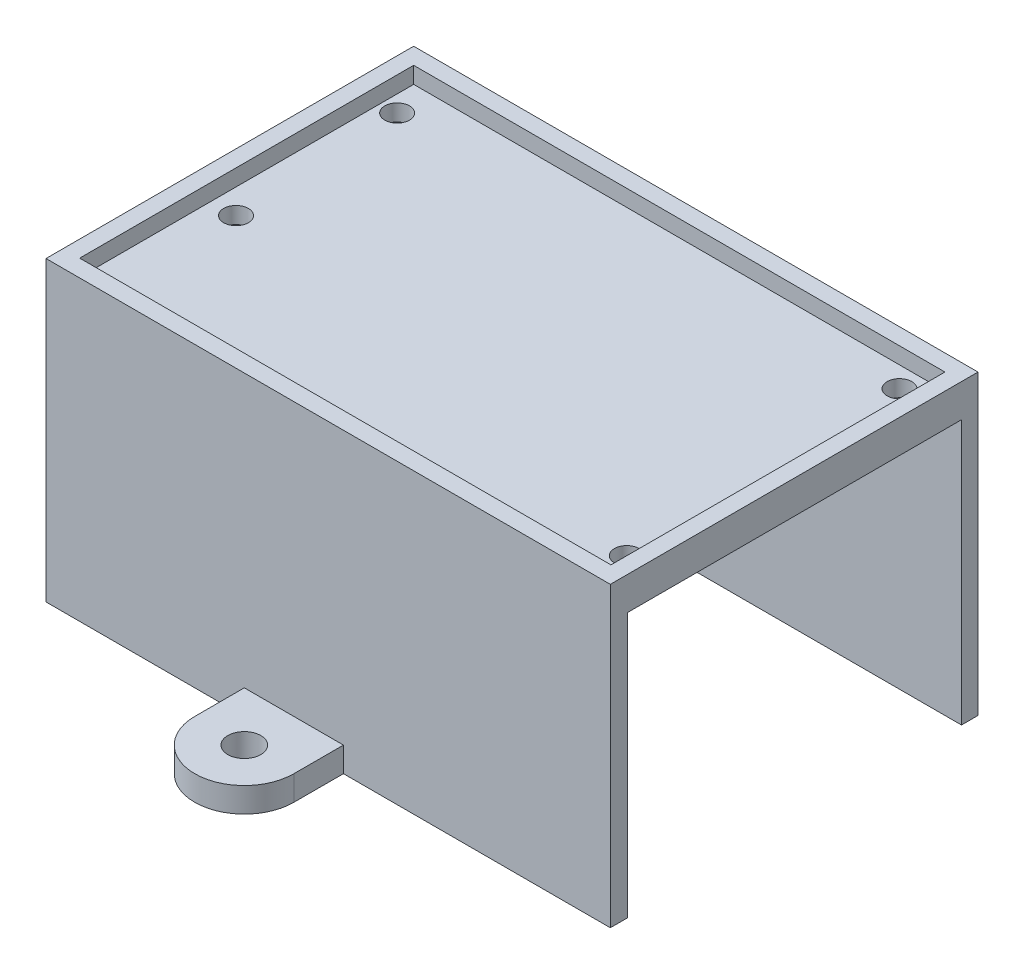
ISO-10303-21;
HEADER;
FILE_DESCRIPTION(('STEP AP214'),'2;1');
FILE_NAME('part.step','',(''),(''),'','','');
FILE_SCHEMA(('AUTOMOTIVE_DESIGN { 1 0 10303 214 1 1 1 1 }'));
ENDSEC;
DATA;
#1=APPLICATION_CONTEXT('core data for automotive mechanical design processes');
#2=APPLICATION_PROTOCOL_DEFINITION('international standard','automotive_design',2000,#1);
#3=PRODUCT_CONTEXT('',#1,'mechanical');
#4=PRODUCT('Part','Part','',(#3));
#5=PRODUCT_RELATED_PRODUCT_CATEGORY('part','',(#4));
#6=PRODUCT_DEFINITION_FORMATION('','',#4);
#7=PRODUCT_DEFINITION_CONTEXT('part definition',#1,'design');
#8=PRODUCT_DEFINITION('design','',#6,#7);
#9=PRODUCT_DEFINITION_SHAPE('','',#8);
#10=(LENGTH_UNIT() NAMED_UNIT(*) SI_UNIT(.MILLI.,.METRE.));
#11=(NAMED_UNIT(*) PLANE_ANGLE_UNIT() SI_UNIT($,.RADIAN.));
#12=(NAMED_UNIT(*) SI_UNIT($,.STERADIAN.) SOLID_ANGLE_UNIT());
#13=UNCERTAINTY_MEASURE_WITH_UNIT(LENGTH_MEASURE(1.E-05),#10,'distance_accuracy_value','');
#14=(GEOMETRIC_REPRESENTATION_CONTEXT(3) GLOBAL_UNCERTAINTY_ASSIGNED_CONTEXT((#13)) GLOBAL_UNIT_ASSIGNED_CONTEXT((#10,
#11,#12)) REPRESENTATION_CONTEXT('',''));
#15=CARTESIAN_POINT('',(0.,0.,0.));
#16=DIRECTION('',(0.,0.,1.));
#17=DIRECTION('',(1.,0.,0.));
#18=AXIS2_PLACEMENT_3D('',#15,#16,#17);
#19=CARTESIAN_POINT('',(0.,4.,-14.9769090909091));
#20=DIRECTION('',(0.,0.,-1.));
#21=DIRECTION('',(-1.,0.,0.));
#22=AXIS2_PLACEMENT_3D('',#19,#20,#21);
#23=PLANE('',#22);
#24=DIRECTION('',(-1.,0.,0.));
#25=VECTOR('',#24,1.);
#26=CARTESIAN_POINT('',(0.,-29.,-14.9769090909091));
#27=LINE('',#26,#25);
#28=CARTESIAN_POINT('',(4.53890909090908,-29.,-14.9769090909091));
#29=VERTEX_POINT('',#28);
#30=CARTESIAN_POINT('',(-7.46109090909092,-29.,-14.9769090909091));
#31=VERTEX_POINT('',#30);
#32=EDGE_CURVE('E331',#29,#31,#27,.T.);
#33=ORIENTED_EDGE('',*,*,#32,.T.);
#34=DIRECTION('',(0.,-1.,0.));
#35=VECTOR('',#34,1.);
#36=CARTESIAN_POINT('',(-7.46109090909092,4.,-14.9769090909091));
#37=LINE('',#36,#35);
#38=CARTESIAN_POINT('',(-7.46109090909092,-32.,-14.9769090909091));
#39=VERTEX_POINT('',#38);
#40=EDGE_CURVE('E304',#31,#39,#37,.T.);
#41=ORIENTED_EDGE('',*,*,#40,.T.);
#42=DIRECTION('',(1.,0.,0.));
#43=VECTOR('',#42,1.);
#44=CARTESIAN_POINT('',(0.,-32.,-14.9769090909091));
#45=LINE('',#44,#43);
#46=CARTESIAN_POINT('',(-31.4610909090909,-32.,-14.9769090909091));
#47=VERTEX_POINT('',#46);
#48=EDGE_CURVE('E409',#47,#39,#45,.T.);
#49=ORIENTED_EDGE('',*,*,#48,.F.);
#50=DIRECTION('',(0.,-1.,0.));
#51=VECTOR('',#50,1.);
#52=CARTESIAN_POINT('',(-31.4610909090909,4.,-14.9769090909091));
#53=LINE('',#52,#51);
#54=CARTESIAN_POINT('',(-31.4610909090909,4.,-14.9769090909091));
#55=VERTEX_POINT('',#54);
#56=EDGE_CURVE('E483',#55,#47,#53,.T.);
#57=ORIENTED_EDGE('',*,*,#56,.F.);
#58=DIRECTION('',(1.,0.,0.));
#59=VECTOR('',#58,1.);
#60=CARTESIAN_POINT('',(0.,4.,-14.9769090909091));
#61=LINE('',#60,#59);
#62=CARTESIAN_POINT('',(36.8389090909091,4.,-14.9769090909091));
#63=VERTEX_POINT('',#62);
#64=EDGE_CURVE('E449',#55,#63,#61,.T.);
#65=ORIENTED_EDGE('',*,*,#64,.T.);
#66=DIRECTION('',(0.,-1.,0.));
#67=VECTOR('',#66,1.);
#68=CARTESIAN_POINT('',(36.8389090909091,4.,-14.9769090909091));
#69=LINE('',#68,#67);
#70=CARTESIAN_POINT('',(36.8389090909091,-32.,-14.9769090909091));
#71=VERTEX_POINT('',#70);
#72=EDGE_CURVE('E474',#63,#71,#69,.T.);
#73=ORIENTED_EDGE('',*,*,#72,.T.);
#74=CARTESIAN_POINT('',(4.53890909090908,-32.,-14.9769090909091));
#75=VERTEX_POINT('',#74);
#76=EDGE_CURVE('E408',#75,#71,#45,.T.);
#77=ORIENTED_EDGE('',*,*,#76,.F.);
#78=DIRECTION('',(0.,-1.,0.));
#79=VECTOR('',#78,1.);
#80=CARTESIAN_POINT('',(4.53890909090908,4.,-14.9769090909091));
#81=LINE('',#80,#79);
#82=EDGE_CURVE('E325',#29,#75,#81,.T.);
#83=ORIENTED_EDGE('',*,*,#82,.F.);
#84=EDGE_LOOP('',(#33,#41,#49,#57,#65,#73,#77,#83));
#85=FACE_BOUND('',#84,.T.);
#86=ADVANCED_FACE('F137',(#85),#23,.T.);
#87=CARTESIAN_POINT('',(0.,4.,29.5230909090909));
#88=DIRECTION('',(0.,0.,-1.));
#89=DIRECTION('',(-1.,0.,0.));
#90=AXIS2_PLACEMENT_3D('',#87,#88,#89);
#91=PLANE('',#90);
#92=DIRECTION('',(0.,-1.,0.));
#93=VECTOR('',#92,1.);
#94=CARTESIAN_POINT('',(-7.46109090909092,-29.,29.5230909090909));
#95=LINE('',#94,#93);
#96=CARTESIAN_POINT('',(-7.46109090909092,-29.,29.5230909090909));
#97=VERTEX_POINT('',#96);
#98=CARTESIAN_POINT('',(-7.46109090909092,-32.,29.5230909090909));
#99=VERTEX_POINT('',#98);
#100=EDGE_CURVE('E367',#97,#99,#95,.T.);
#101=ORIENTED_EDGE('',*,*,#100,.F.);
#102=DIRECTION('',(-1.,0.,0.));
#103=VECTOR('',#102,1.);
#104=CARTESIAN_POINT('',(0.,-29.,29.5230909090909));
#105=LINE('',#104,#103);
#106=CARTESIAN_POINT('',(4.53890909090908,-29.,29.5230909090909));
#107=VERTEX_POINT('',#106);
#108=EDGE_CURVE('E334',#107,#97,#105,.T.);
#109=ORIENTED_EDGE('',*,*,#108,.F.);
#110=DIRECTION('',(0.,-1.,0.));
#111=VECTOR('',#110,1.);
#112=CARTESIAN_POINT('',(4.53890909090908,-29.,29.5230909090909));
#113=LINE('',#112,#111);
#114=CARTESIAN_POINT('',(4.53890909090908,-32.,29.5230909090909));
#115=VERTEX_POINT('',#114);
#116=EDGE_CURVE('E353',#107,#115,#113,.T.);
#117=ORIENTED_EDGE('',*,*,#116,.T.);
#118=DIRECTION('',(-1.,0.,0.));
#119=VECTOR('',#118,1.);
#120=CARTESIAN_POINT('',(0.,-32.,29.5230909090909));
#121=LINE('',#120,#119);
#122=CARTESIAN_POINT('',(36.8389090909091,-32.,29.5230909090909));
#123=VERTEX_POINT('',#122);
#124=EDGE_CURVE('E393',#123,#115,#121,.T.);
#125=ORIENTED_EDGE('',*,*,#124,.F.);
#126=DIRECTION('',(0.,-1.,0.));
#127=VECTOR('',#126,1.);
#128=CARTESIAN_POINT('',(36.8389090909091,4.,29.5230909090909));
#129=LINE('',#128,#127);
#130=CARTESIAN_POINT('',(36.8389090909091,4.,29.5230909090909));
#131=VERTEX_POINT('',#130);
#132=EDGE_CURVE('E491',#131,#123,#129,.T.);
#133=ORIENTED_EDGE('',*,*,#132,.F.);
#134=DIRECTION('',(1.,0.,0.));
#135=VECTOR('',#134,1.);
#136=CARTESIAN_POINT('',(0.,4.,29.5230909090909));
#137=LINE('',#136,#135);
#138=CARTESIAN_POINT('',(-31.4610909090909,4.,29.5230909090909));
#139=VERTEX_POINT('',#138);
#140=EDGE_CURVE('E456',#139,#131,#137,.T.);
#141=ORIENTED_EDGE('',*,*,#140,.F.);
#142=DIRECTION('',(0.,-1.,0.));
#143=VECTOR('',#142,1.);
#144=CARTESIAN_POINT('',(-31.4610909090909,4.,29.5230909090909));
#145=LINE('',#144,#143);
#146=CARTESIAN_POINT('',(-31.4610909090909,-32.,29.5230909090909));
#147=VERTEX_POINT('',#146);
#148=EDGE_CURVE('E494',#139,#147,#145,.T.);
#149=ORIENTED_EDGE('',*,*,#148,.T.);
#150=EDGE_CURVE('E392',#99,#147,#121,.T.);
#151=ORIENTED_EDGE('',*,*,#150,.F.);
#152=EDGE_LOOP('',(#101,#109,#117,#125,#133,#141,#149,#151));
#153=FACE_BOUND('',#152,.T.);
#154=ADVANCED_FACE('F543',(#153),#91,.F.);
#155=CARTESIAN_POINT('',(-26.4610909090909,2.,11.5230909090909));
#156=DIRECTION('',(0.,-1.,0.));
#157=DIRECTION('',(0.,0.,-1.));
#158=AXIS2_PLACEMENT_3D('',#155,#156,#157);
#159=CYLINDRICAL_SURFACE('',#158,1.5);
#160=CARTESIAN_POINT('',(-26.4610909090909,2.,11.5230909090909));
#161=DIRECTION('',(0.,1.,0.));
#162=DIRECTION('',(0.,0.,1.));
#163=AXIS2_PLACEMENT_3D('',#160,#161,#162);
#164=CIRCLE('',#163,1.5);
#165=CARTESIAN_POINT('',(-26.4610909090909,2.,13.0230909090909));
#166=VERTEX_POINT('',#165);
#167=EDGE_CURVE('E512',#166,#166,#164,.T.);
#168=ORIENTED_EDGE('',*,*,#167,.T.);
#169=EDGE_LOOP('',(#168));
#170=FACE_BOUND('',#169,.T.);
#171=CARTESIAN_POINT('',(-26.4610909090909,0.,11.5230909090909));
#172=DIRECTION('',(0.,1.,0.));
#173=DIRECTION('',(0.,0.,1.));
#174=AXIS2_PLACEMENT_3D('',#171,#172,#173);
#175=CIRCLE('',#174,1.5);
#176=CARTESIAN_POINT('',(-26.4610909090909,0.,13.0230909090909));
#177=VERTEX_POINT('',#176);
#178=EDGE_CURVE('E141',#177,#177,#175,.T.);
#179=ORIENTED_EDGE('',*,*,#178,.F.);
#180=EDGE_LOOP('',(#179));
#181=FACE_BOUND('',#180,.T.);
#182=ADVANCED_FACE('F540',(#170,#181),#159,.F.);
#183=CARTESIAN_POINT('',(31.8389090909091,2.,-10.4769090909091));
#184=DIRECTION('',(0.,-1.,0.));
#185=DIRECTION('',(0.,0.,-1.));
#186=AXIS2_PLACEMENT_3D('',#183,#184,#185);
#187=CYLINDRICAL_SURFACE('',#186,1.5);
#188=CARTESIAN_POINT('',(31.8389090909091,2.,-10.4769090909091));
#189=DIRECTION('',(0.,1.,0.));
#190=DIRECTION('',(0.,0.,1.));
#191=AXIS2_PLACEMENT_3D('',#188,#189,#190);
#192=CIRCLE('',#191,1.5);
#193=CARTESIAN_POINT('',(31.8389090909091,2.,-8.97690909090909));
#194=VERTEX_POINT('',#193);
#195=EDGE_CURVE('E508',#194,#194,#192,.T.);
#196=ORIENTED_EDGE('',*,*,#195,.T.);
#197=EDGE_LOOP('',(#196));
#198=FACE_BOUND('',#197,.T.);
#199=CARTESIAN_POINT('',(31.8389090909091,0.,-10.4769090909091));
#200=DIRECTION('',(0.,1.,0.));
#201=DIRECTION('',(0.,0.,1.));
#202=AXIS2_PLACEMENT_3D('',#199,#200,#201);
#203=CIRCLE('',#202,1.5);
#204=CARTESIAN_POINT('',(31.8389090909091,0.,-8.97690909090909));
#205=VERTEX_POINT('',#204);
#206=EDGE_CURVE('E528',#205,#205,#203,.T.);
#207=ORIENTED_EDGE('',*,*,#206,.F.);
#208=EDGE_LOOP('',(#207));
#209=FACE_BOUND('',#208,.T.);
#210=ADVANCED_FACE('F542',(#198,#209),#187,.F.);
#211=CARTESIAN_POINT('',(32.8389090909091,2.,23.5230909090909));
#212=DIRECTION('',(0.,-1.,0.));
#213=DIRECTION('',(0.,0.,-1.));
#214=AXIS2_PLACEMENT_3D('',#211,#212,#213);
#215=CYLINDRICAL_SURFACE('',#214,1.5);
#216=CARTESIAN_POINT('',(32.8389090909091,2.,23.5230909090909));
#217=DIRECTION('',(0.,1.,0.));
#218=DIRECTION('',(0.,0.,1.));
#219=AXIS2_PLACEMENT_3D('',#216,#217,#218);
#220=CIRCLE('',#219,1.5);
#221=CARTESIAN_POINT('',(32.8389090909091,2.,25.0230909090909));
#222=VERTEX_POINT('',#221);
#223=EDGE_CURVE('E504',#222,#222,#220,.T.);
#224=ORIENTED_EDGE('',*,*,#223,.T.);
#225=EDGE_LOOP('',(#224));
#226=FACE_BOUND('',#225,.T.);
#227=CARTESIAN_POINT('',(32.8389090909091,0.,23.5230909090909));
#228=DIRECTION('',(0.,1.,0.));
#229=DIRECTION('',(0.,0.,1.));
#230=AXIS2_PLACEMENT_3D('',#227,#228,#229);
#231=CIRCLE('',#230,1.5);
#232=CARTESIAN_POINT('',(32.8389090909091,0.,25.0230909090909));
#233=VERTEX_POINT('',#232);
#234=EDGE_CURVE('E525',#233,#233,#231,.T.);
#235=ORIENTED_EDGE('',*,*,#234,.F.);
#236=EDGE_LOOP('',(#235));
#237=FACE_BOUND('',#236,.T.);
#238=ADVANCED_FACE('F550',(#226,#237),#215,.F.);
#239=CARTESIAN_POINT('',(-27.4610909090909,2.,-8.97690909090909));
#240=DIRECTION('',(0.,-1.,0.));
#241=DIRECTION('',(0.,0.,-1.));
#242=AXIS2_PLACEMENT_3D('',#239,#240,#241);
#243=CYLINDRICAL_SURFACE('',#242,1.5);
#244=CARTESIAN_POINT('',(-27.4610909090909,2.,-8.97690909090909));
#245=DIRECTION('',(0.,1.,0.));
#246=DIRECTION('',(0.,0.,1.));
#247=AXIS2_PLACEMENT_3D('',#244,#245,#246);
#248=CIRCLE('',#247,1.5);
#249=CARTESIAN_POINT('',(-27.4610909090909,2.,-7.47690909090909));
#250=VERTEX_POINT('',#249);
#251=EDGE_CURVE('E500',#250,#250,#248,.T.);
#252=ORIENTED_EDGE('',*,*,#251,.T.);
#253=EDGE_LOOP('',(#252));
#254=FACE_BOUND('',#253,.T.);
#255=CARTESIAN_POINT('',(-27.4610909090909,0.,-8.97690909090909));
#256=DIRECTION('',(0.,1.,0.));
#257=DIRECTION('',(0.,0.,1.));
#258=AXIS2_PLACEMENT_3D('',#255,#256,#257);
#259=CIRCLE('',#258,1.5);
#260=CARTESIAN_POINT('',(-27.4610909090909,0.,-7.47690909090909));
#261=VERTEX_POINT('',#260);
#262=EDGE_CURVE('E487',#261,#261,#259,.T.);
#263=ORIENTED_EDGE('',*,*,#262,.F.);
#264=EDGE_LOOP('',(#263));
#265=FACE_BOUND('',#264,.T.);
#266=ADVANCED_FACE('F139',(#254,#265),#243,.F.);
#267=CARTESIAN_POINT('',(0.,2.,0.));
#268=DIRECTION('',(0.,1.,0.));
#269=DIRECTION('',(0.,0.,1.));
#270=AXIS2_PLACEMENT_3D('',#267,#268,#269);
#271=PLANE('',#270);
#272=DIRECTION('',(-1.,0.,0.));
#273=VECTOR('',#272,1.);
#274=CARTESIAN_POINT('',(0.,2.,27.4469969090628));
#275=LINE('',#274,#273);
#276=CARTESIAN_POINT('',(34.8389090909091,2.,27.4469969090628));
#277=VERTEX_POINT('',#276);
#278=CARTESIAN_POINT('',(-29.4610909090909,2.,27.4469969090628));
#279=VERTEX_POINT('',#278);
#280=EDGE_CURVE('E440',#277,#279,#275,.T.);
#281=ORIENTED_EDGE('',*,*,#280,.F.);
#282=DIRECTION('',(0.,0.,1.));
#283=VECTOR('',#282,1.);
#284=CARTESIAN_POINT('',(34.8389090909091,2.,0.));
#285=LINE('',#284,#283);
#286=CARTESIAN_POINT('',(34.8389090909091,2.,-12.9769090909091));
#287=VERTEX_POINT('',#286);
#288=EDGE_CURVE('E516',#287,#277,#285,.T.);
#289=ORIENTED_EDGE('',*,*,#288,.F.);
#290=DIRECTION('',(1.,0.,0.));
#291=VECTOR('',#290,1.);
#292=CARTESIAN_POINT('',(0.,2.,-12.9769090909091));
#293=LINE('',#292,#291);
#294=CARTESIAN_POINT('',(-29.4610909090909,2.,-12.9769090909091));
#295=VERTEX_POINT('',#294);
#296=EDGE_CURVE('E147',#295,#287,#293,.T.);
#297=ORIENTED_EDGE('',*,*,#296,.F.);
#298=DIRECTION('',(0.,0.,1.));
#299=VECTOR('',#298,1.);
#300=CARTESIAN_POINT('',(-29.4610909090909,2.,0.));
#301=LINE('',#300,#299);
#302=EDGE_CURVE('E12',#295,#279,#301,.T.);
#303=ORIENTED_EDGE('',*,*,#302,.T.);
#304=EDGE_LOOP('',(#281,#289,#297,#303));
#305=FACE_BOUND('',#304,.T.);
#306=ORIENTED_EDGE('',*,*,#251,.F.);
#307=EDGE_LOOP('',(#306));
#308=FACE_BOUND('',#307,.T.);
#309=ORIENTED_EDGE('',*,*,#223,.F.);
#310=EDGE_LOOP('',(#309));
#311=FACE_BOUND('',#310,.T.);
#312=ORIENTED_EDGE('',*,*,#195,.F.);
#313=EDGE_LOOP('',(#312));
#314=FACE_BOUND('',#313,.T.);
#315=ORIENTED_EDGE('',*,*,#167,.F.);
#316=EDGE_LOOP('',(#315));
#317=FACE_BOUND('',#316,.T.);
#318=ADVANCED_FACE('F564',(#305,#308,#311,#314,#317),#271,.T.);
#319=CARTESIAN_POINT('',(0.,0.,0.));
#320=DIRECTION('',(0.,1.,0.));
#321=DIRECTION('',(0.,0.,1.));
#322=AXIS2_PLACEMENT_3D('',#319,#320,#321);
#323=PLANE('',#322);
#324=ORIENTED_EDGE('',*,*,#262,.T.);
#325=EDGE_LOOP('',(#324));
#326=FACE_BOUND('',#325,.T.);
#327=ORIENTED_EDGE('',*,*,#234,.T.);
#328=EDGE_LOOP('',(#327));
#329=FACE_BOUND('',#328,.T.);
#330=ORIENTED_EDGE('',*,*,#206,.T.);
#331=EDGE_LOOP('',(#330));
#332=FACE_BOUND('',#331,.T.);
#333=ORIENTED_EDGE('',*,*,#178,.T.);
#334=EDGE_LOOP('',(#333));
#335=FACE_BOUND('',#334,.T.);
#336=DIRECTION('',(0.,0.,1.));
#337=VECTOR('',#336,1.);
#338=CARTESIAN_POINT('',(36.8389090909091,0.,0.));
#339=LINE('',#338,#337);
#340=CARTESIAN_POINT('',(36.8389090909091,0.,-12.977521957801));
#341=VERTEX_POINT('',#340);
#342=CARTESIAN_POINT('',(36.8389090909091,0.,27.4469969090628));
#343=VERTEX_POINT('',#342);
#344=EDGE_CURVE('E448',#341,#343,#339,.T.);
#345=ORIENTED_EDGE('',*,*,#344,.T.);
#346=DIRECTION('',(-1.,0.,0.));
#347=VECTOR('',#346,1.);
#348=CARTESIAN_POINT('',(0.,0.,27.4469969090628));
#349=LINE('',#348,#347);
#350=CARTESIAN_POINT('',(-29.4610909090909,0.,27.4469969090628));
#351=VERTEX_POINT('',#350);
#352=EDGE_CURVE('E444',#343,#351,#349,.T.);
#353=ORIENTED_EDGE('',*,*,#352,.T.);
#354=DIRECTION('',(0.,0.,-1.));
#355=VECTOR('',#354,1.);
#356=CARTESIAN_POINT('',(-29.4610909090909,0.,0.));
#357=LINE('',#356,#355);
#358=CARTESIAN_POINT('',(-29.4610909090909,0.,-12.977521957801));
#359=VERTEX_POINT('',#358);
#360=EDGE_CURVE('E429',#351,#359,#357,.T.);
#361=ORIENTED_EDGE('',*,*,#360,.T.);
#362=DIRECTION('',(-1.,0.,0.));
#363=VECTOR('',#362,1.);
#364=CARTESIAN_POINT('',(0.,0.,-12.977521957801));
#365=LINE('',#364,#363);
#366=EDGE_CURVE('E433',#341,#359,#365,.T.);
#367=ORIENTED_EDGE('',*,*,#366,.F.);
#368=EDGE_LOOP('',(#345,#353,#361,#367));
#369=FACE_BOUND('',#368,.T.);
#370=ADVANCED_FACE('F537',(#326,#329,#332,#335,#369),#323,.F.);
#371=CARTESIAN_POINT('',(0.,4.,-12.9769090909091));
#372=DIRECTION('',(0.,0.,-1.));
#373=DIRECTION('',(-1.,0.,0.));
#374=AXIS2_PLACEMENT_3D('',#371,#372,#373);
#375=PLANE('',#374);
#376=ORIENTED_EDGE('',*,*,#296,.T.);
#377=DIRECTION('',(0.,-1.,0.));
#378=VECTOR('',#377,1.);
#379=CARTESIAN_POINT('',(34.8389090909091,4.,-12.9769090909091));
#380=LINE('',#379,#378);
#381=CARTESIAN_POINT('',(34.8389090909091,4.,-12.9769090909091));
#382=VERTEX_POINT('',#381);
#383=EDGE_CURVE('E482',#382,#287,#380,.T.);
#384=ORIENTED_EDGE('',*,*,#383,.F.);
#385=DIRECTION('',(1.,0.,0.));
#386=VECTOR('',#385,1.);
#387=CARTESIAN_POINT('',(0.,4.,-12.9769090909091));
#388=LINE('',#387,#386);
#389=CARTESIAN_POINT('',(-29.4610909090909,4.,-12.9769090909091));
#390=VERTEX_POINT('',#389);
#391=EDGE_CURVE('E463',#390,#382,#388,.T.);
#392=ORIENTED_EDGE('',*,*,#391,.F.);
#393=DIRECTION('',(0.,-1.,0.));
#394=VECTOR('',#393,1.);
#395=CARTESIAN_POINT('',(-29.4610909090909,4.,-12.9769090909091));
#396=LINE('',#395,#394);
#397=EDGE_CURVE('E478',#390,#295,#396,.T.);
#398=ORIENTED_EDGE('',*,*,#397,.T.);
#399=EDGE_LOOP('',(#376,#384,#392,#398));
#400=FACE_BOUND('',#399,.T.);
#401=ADVANCED_FACE('F568',(#400),#375,.F.);
#402=CARTESIAN_POINT('',(34.8389090909091,4.,0.));
#403=DIRECTION('',(1.,0.,0.));
#404=DIRECTION('',(0.,0.,-1.));
#405=AXIS2_PLACEMENT_3D('',#402,#403,#404);
#406=PLANE('',#405);
#407=ORIENTED_EDGE('',*,*,#288,.T.);
#408=DIRECTION('',(0.,1.,0.));
#409=VECTOR('',#408,1.);
#410=CARTESIAN_POINT('',(34.8389090909091,4.,27.4469969090628));
#411=LINE('',#410,#409);
#412=CARTESIAN_POINT('',(34.8389090909091,4.,27.4469969090628));
#413=VERTEX_POINT('',#412);
#414=EDGE_CURVE('E437',#277,#413,#411,.T.);
#415=ORIENTED_EDGE('',*,*,#414,.T.);
#416=DIRECTION('',(0.,0.,1.));
#417=VECTOR('',#416,1.);
#418=CARTESIAN_POINT('',(34.8389090909091,4.,0.));
#419=LINE('',#418,#417);
#420=EDGE_CURVE('E467',#382,#413,#419,.T.);
#421=ORIENTED_EDGE('',*,*,#420,.F.);
#422=ORIENTED_EDGE('',*,*,#383,.T.);
#423=EDGE_LOOP('',(#407,#415,#421,#422));
#424=FACE_BOUND('',#423,.T.);
#425=ADVANCED_FACE('F573',(#424),#406,.F.);
#426=CARTESIAN_POINT('',(-31.4610909090909,4.,0.));
#427=DIRECTION('',(1.,0.,0.));
#428=DIRECTION('',(0.,0.,-1.));
#429=AXIS2_PLACEMENT_3D('',#426,#427,#428);
#430=PLANE('',#429);
#431=ORIENTED_EDGE('',*,*,#56,.T.);
#432=DIRECTION('',(0.,0.,-1.));
#433=VECTOR('',#432,1.);
#434=CARTESIAN_POINT('',(-31.4610909090909,-32.,0.));
#435=LINE('',#434,#433);
#436=EDGE_CURVE('E379',#147,#47,#435,.T.);
#437=ORIENTED_EDGE('',*,*,#436,.F.);
#438=ORIENTED_EDGE('',*,*,#148,.F.);
#439=DIRECTION('',(0.,0.,1.));
#440=VECTOR('',#439,1.);
#441=CARTESIAN_POINT('',(-31.4610909090909,4.,0.));
#442=LINE('',#441,#440);
#443=EDGE_CURVE('E453',#55,#139,#442,.T.);
#444=ORIENTED_EDGE('',*,*,#443,.F.);
#445=EDGE_LOOP('',(#431,#437,#438,#444));
#446=FACE_BOUND('',#445,.T.);
#447=ADVANCED_FACE('F563',(#446),#430,.F.);
#448=CARTESIAN_POINT('',(36.8389090909091,4.,0.));
#449=DIRECTION('',(1.,0.,0.));
#450=DIRECTION('',(0.,0.,-1.));
#451=AXIS2_PLACEMENT_3D('',#448,#449,#450);
#452=PLANE('',#451);
#453=DIRECTION('',(0.,0.,1.));
#454=VECTOR('',#453,1.);
#455=CARTESIAN_POINT('',(36.8389090909091,4.,0.));
#456=LINE('',#455,#454);
#457=EDGE_CURVE('E460',#63,#131,#456,.T.);
#458=ORIENTED_EDGE('',*,*,#457,.T.);
#459=ORIENTED_EDGE('',*,*,#132,.T.);
#460=DIRECTION('',(0.,0.,1.));
#461=VECTOR('',#460,1.);
#462=CARTESIAN_POINT('',(36.8389090909091,-32.,0.));
#463=LINE('',#462,#461);
#464=CARTESIAN_POINT('',(36.8389090909091,-32.,27.4469969090628));
#465=VERTEX_POINT('',#464);
#466=EDGE_CURVE('E388',#465,#123,#463,.T.);
#467=ORIENTED_EDGE('',*,*,#466,.F.);
#468=DIRECTION('',(0.,-1.,0.));
#469=VECTOR('',#468,1.);
#470=CARTESIAN_POINT('',(36.8389090909091,4.,27.4469969090628));
#471=LINE('',#470,#469);
#472=EDGE_CURVE('E401',#343,#465,#471,.T.);
#473=ORIENTED_EDGE('',*,*,#472,.F.);
#474=ORIENTED_EDGE('',*,*,#344,.F.);
#475=DIRECTION('',(0.,1.,0.));
#476=VECTOR('',#475,1.);
#477=CARTESIAN_POINT('',(36.8389090909091,-32.,-12.977521957801));
#478=LINE('',#477,#476);
#479=CARTESIAN_POINT('',(36.8389090909091,-32.,-12.977521957801));
#480=VERTEX_POINT('',#479);
#481=EDGE_CURVE('E417',#480,#341,#478,.T.);
#482=ORIENTED_EDGE('',*,*,#481,.F.);
#483=DIRECTION('',(0.,0.,1.));
#484=VECTOR('',#483,1.);
#485=CARTESIAN_POINT('',(36.8389090909091,-32.,0.));
#486=LINE('',#485,#484);
#487=EDGE_CURVE('E413',#71,#480,#486,.T.);
#488=ORIENTED_EDGE('',*,*,#487,.F.);
#489=ORIENTED_EDGE('',*,*,#72,.F.);
#490=EDGE_LOOP('',(#458,#459,#467,#473,#474,#482,#488,#489));
#491=FACE_BOUND('',#490,.T.);
#492=ADVANCED_FACE('F629',(#491),#452,.T.);
#493=CARTESIAN_POINT('',(-29.4610909090909,4.,0.));
#494=DIRECTION('',(1.,0.,0.));
#495=DIRECTION('',(0.,0.,-1.));
#496=AXIS2_PLACEMENT_3D('',#493,#494,#495);
#497=PLANE('',#496);
#498=DIRECTION('',(0.,1.,0.));
#499=VECTOR('',#498,1.);
#500=CARTESIAN_POINT('',(-29.4610909090909,-32.,27.4469969090628));
#501=LINE('',#500,#499);
#502=CARTESIAN_POINT('',(-29.4610909090909,4.,27.4469969090628));
#503=VERTEX_POINT('',#502);
#504=EDGE_CURVE('E404',#279,#503,#501,.T.);
#505=ORIENTED_EDGE('',*,*,#504,.F.);
#506=ORIENTED_EDGE('',*,*,#302,.F.);
#507=ORIENTED_EDGE('',*,*,#397,.F.);
#508=DIRECTION('',(0.,0.,1.));
#509=VECTOR('',#508,1.);
#510=CARTESIAN_POINT('',(-29.4610909090909,4.,0.));
#511=LINE('',#510,#509);
#512=EDGE_CURVE('E471',#390,#503,#511,.T.);
#513=ORIENTED_EDGE('',*,*,#512,.T.);
#514=EDGE_LOOP('',(#505,#506,#507,#513));
#515=FACE_BOUND('',#514,.T.);
#516=ADVANCED_FACE('F640',(#515),#497,.T.);
#517=CARTESIAN_POINT('',(0.,4.,0.));
#518=DIRECTION('',(0.,1.,0.));
#519=DIRECTION('',(0.,0.,1.));
#520=AXIS2_PLACEMENT_3D('',#517,#518,#519);
#521=PLANE('',#520);
#522=ORIENTED_EDGE('',*,*,#420,.T.);
#523=DIRECTION('',(1.,0.,0.));
#524=VECTOR('',#523,1.);
#525=CARTESIAN_POINT('',(0.,4.,27.4469969090628));
#526=LINE('',#525,#524);
#527=EDGE_CURVE('E397',#503,#413,#526,.T.);
#528=ORIENTED_EDGE('',*,*,#527,.F.);
#529=ORIENTED_EDGE('',*,*,#512,.F.);
#530=ORIENTED_EDGE('',*,*,#391,.T.);
#531=EDGE_LOOP('',(#522,#528,#529,#530));
#532=FACE_BOUND('',#531,.T.);
#533=ORIENTED_EDGE('',*,*,#140,.T.);
#534=ORIENTED_EDGE('',*,*,#457,.F.);
#535=ORIENTED_EDGE('',*,*,#64,.F.);
#536=ORIENTED_EDGE('',*,*,#443,.T.);
#537=EDGE_LOOP('',(#533,#534,#535,#536));
#538=FACE_BOUND('',#537,.T.);
#539=ADVANCED_FACE('F652',(#532,#538),#521,.T.);
#540=CARTESIAN_POINT('',(0.,4.,27.4469969090628));
#541=DIRECTION('',(0.,0.,-1.));
#542=DIRECTION('',(-1.,0.,0.));
#543=AXIS2_PLACEMENT_3D('',#540,#541,#542);
#544=PLANE('',#543);
#545=ORIENTED_EDGE('',*,*,#414,.F.);
#546=ORIENTED_EDGE('',*,*,#280,.T.);
#547=ORIENTED_EDGE('',*,*,#504,.T.);
#548=ORIENTED_EDGE('',*,*,#527,.T.);
#549=EDGE_LOOP('',(#545,#546,#547,#548));
#550=FACE_BOUND('',#549,.T.);
#551=ADVANCED_FACE('F664',(#550),#544,.T.);
#552=ORIENTED_EDGE('',*,*,#352,.F.);
#553=ORIENTED_EDGE('',*,*,#472,.T.);
#554=DIRECTION('',(1.,0.,0.));
#555=VECTOR('',#554,1.);
#556=CARTESIAN_POINT('',(0.,-32.,27.4469969090628));
#557=LINE('',#556,#555);
#558=CARTESIAN_POINT('',(-29.4610909090909,-32.,27.4469969090628));
#559=VERTEX_POINT('',#558);
#560=EDGE_CURVE('E383',#559,#465,#557,.T.);
#561=ORIENTED_EDGE('',*,*,#560,.F.);
#562=EDGE_CURVE('E425',#559,#351,#501,.T.);
#563=ORIENTED_EDGE('',*,*,#562,.T.);
#564=EDGE_LOOP('',(#552,#553,#561,#563));
#565=FACE_BOUND('',#564,.T.);
#566=ADVANCED_FACE('F676',(#565),#544,.T.);
#567=CARTESIAN_POINT('',(0.,4.,-12.977521957801));
#568=DIRECTION('',(0.,0.,-1.));
#569=DIRECTION('',(-1.,0.,0.));
#570=AXIS2_PLACEMENT_3D('',#567,#568,#569);
#571=PLANE('',#570);
#572=DIRECTION('',(1.,0.,0.));
#573=VECTOR('',#572,1.);
#574=CARTESIAN_POINT('',(0.,-32.,-12.977521957801));
#575=LINE('',#574,#573);
#576=CARTESIAN_POINT('',(-29.4610909090909,-32.,-12.977521957801));
#577=VERTEX_POINT('',#576);
#578=EDGE_CURVE('E405',#577,#480,#575,.T.);
#579=ORIENTED_EDGE('',*,*,#578,.T.);
#580=ORIENTED_EDGE('',*,*,#481,.T.);
#581=ORIENTED_EDGE('',*,*,#366,.T.);
#582=DIRECTION('',(0.,1.,0.));
#583=VECTOR('',#582,1.);
#584=CARTESIAN_POINT('',(-29.4610909090909,-32.,-12.977521957801));
#585=LINE('',#584,#583);
#586=EDGE_CURVE('E384',#577,#359,#585,.T.);
#587=ORIENTED_EDGE('',*,*,#586,.F.);
#588=EDGE_LOOP('',(#579,#580,#581,#587));
#589=FACE_BOUND('',#588,.T.);
#590=ADVANCED_FACE('F687',(#589),#571,.F.);
#591=CARTESIAN_POINT('',(-29.4610909090909,4.,-14.9769090909091));
#592=DIRECTION('',(1.,0.,0.));
#593=DIRECTION('',(0.,0.,-1.));
#594=AXIS2_PLACEMENT_3D('',#591,#592,#593);
#595=PLANE('',#594);
#596=ORIENTED_EDGE('',*,*,#360,.F.);
#597=ORIENTED_EDGE('',*,*,#562,.F.);
#598=DIRECTION('',(0.,0.,1.));
#599=VECTOR('',#598,1.);
#600=CARTESIAN_POINT('',(-29.4610909090909,-32.,-14.9769090909091));
#601=LINE('',#600,#599);
#602=EDGE_CURVE('E370',#577,#559,#601,.T.);
#603=ORIENTED_EDGE('',*,*,#602,.F.);
#604=ORIENTED_EDGE('',*,*,#586,.T.);
#605=EDGE_LOOP('',(#596,#597,#603,#604));
#606=FACE_BOUND('',#605,.T.);
#607=ADVANCED_FACE('F694',(#606),#595,.T.);
#608=CARTESIAN_POINT('',(0.,-32.,0.));
#609=DIRECTION('',(0.,-1.,0.));
#610=DIRECTION('',(0.,0.,-1.));
#611=AXIS2_PLACEMENT_3D('',#608,#609,#610);
#612=PLANE('',#611);
#613=ORIENTED_EDGE('',*,*,#487,.T.);
#614=ORIENTED_EDGE('',*,*,#578,.F.);
#615=ORIENTED_EDGE('',*,*,#602,.T.);
#616=ORIENTED_EDGE('',*,*,#560,.T.);
#617=ORIENTED_EDGE('',*,*,#466,.T.);
#618=ORIENTED_EDGE('',*,*,#124,.T.);
#619=DIRECTION('',(0.,0.,-1.));
#620=VECTOR('',#619,1.);
#621=CARTESIAN_POINT('',(4.53890909090908,-32.,0.));
#622=LINE('',#621,#620);
#623=CARTESIAN_POINT('',(4.53890909090908,-32.,35.5230909090909));
#624=VERTEX_POINT('',#623);
#625=EDGE_CURVE('E163',#624,#115,#622,.T.);
#626=ORIENTED_EDGE('',*,*,#625,.F.);
#627=CARTESIAN_POINT('',(-1.46109090909092,-32.,35.5230909090909));
#628=DIRECTION('',(0.,-1.,0.));
#629=DIRECTION('',(0.,0.,-1.));
#630=AXIS2_PLACEMENT_3D('',#627,#628,#629);
#631=CIRCLE('',#630,6.);
#632=CARTESIAN_POINT('',(-7.46109090909092,-32.,35.5230909090909));
#633=VERTEX_POINT('',#632);
#634=EDGE_CURVE('E356',#624,#633,#631,.T.);
#635=ORIENTED_EDGE('',*,*,#634,.T.);
#636=DIRECTION('',(0.,0.,-1.));
#637=VECTOR('',#636,1.);
#638=CARTESIAN_POINT('',(-7.46109090909092,-32.,0.));
#639=LINE('',#638,#637);
#640=EDGE_CURVE('E360',#633,#99,#639,.T.);
#641=ORIENTED_EDGE('',*,*,#640,.T.);
#642=ORIENTED_EDGE('',*,*,#150,.T.);
#643=ORIENTED_EDGE('',*,*,#436,.T.);
#644=ORIENTED_EDGE('',*,*,#48,.T.);
#645=DIRECTION('',(0.,0.,1.));
#646=VECTOR('',#645,1.);
#647=CARTESIAN_POINT('',(-7.46109090909092,-32.,0.));
#648=LINE('',#647,#646);
#649=CARTESIAN_POINT('',(-7.46109090909092,-32.,-21.0536159578291));
#650=VERTEX_POINT('',#649);
#651=EDGE_CURVE('E317',#650,#39,#648,.T.);
#652=ORIENTED_EDGE('',*,*,#651,.F.);
#653=CARTESIAN_POINT('',(-1.46109090909092,-32.,-21.0536159578291));
#654=DIRECTION('',(0.,-1.,0.));
#655=DIRECTION('',(0.,0.,-1.));
#656=AXIS2_PLACEMENT_3D('',#653,#654,#655);
#657=CIRCLE('',#656,6.);
#658=CARTESIAN_POINT('',(4.53890909090908,-32.,-21.0536159578291));
#659=VERTEX_POINT('',#658);
#660=EDGE_CURVE('E295',#659,#650,#657,.F.);
#661=ORIENTED_EDGE('',*,*,#660,.F.);
#662=DIRECTION('',(0.,0.,1.));
#663=VECTOR('',#662,1.);
#664=CARTESIAN_POINT('',(4.53890909090908,-32.,0.));
#665=LINE('',#664,#663);
#666=EDGE_CURVE('E155',#659,#75,#665,.T.);
#667=ORIENTED_EDGE('',*,*,#666,.T.);
#668=ORIENTED_EDGE('',*,*,#76,.T.);
#669=EDGE_LOOP('',(#613,#614,#615,#616,#617,#618,#626,#635,#641,#642,#643,#644,#652,#661,#667,#668));
#670=FACE_BOUND('',#669,.T.);
#671=CARTESIAN_POINT('',(-1.46109090909092,-32.,35.5230909090909));
#672=DIRECTION('',(0.,-1.,0.));
#673=DIRECTION('',(0.,0.,-1.));
#674=AXIS2_PLACEMENT_3D('',#671,#672,#673);
#675=CIRCLE('',#674,2.);
#676=CARTESIAN_POINT('',(-1.46109090909092,-32.,33.5230909090909));
#677=VERTEX_POINT('',#676);
#678=EDGE_CURVE('E338',#677,#677,#675,.T.);
#679=ORIENTED_EDGE('',*,*,#678,.F.);
#680=EDGE_LOOP('',(#679));
#681=FACE_BOUND('',#680,.T.);
#682=CARTESIAN_POINT('',(-1.46109090909092,-32.,-21.0536159578291));
#683=DIRECTION('',(0.,-1.,0.));
#684=DIRECTION('',(0.,0.,-1.));
#685=AXIS2_PLACEMENT_3D('',#682,#683,#684);
#686=CIRCLE('',#685,2.);
#687=CARTESIAN_POINT('',(-1.46109090909092,-32.,-23.0536159578291));
#688=VERTEX_POINT('',#687);
#689=EDGE_CURVE('E306',#688,#688,#686,.F.);
#690=ORIENTED_EDGE('',*,*,#689,.T.);
#691=EDGE_LOOP('',(#690));
#692=FACE_BOUND('',#691,.T.);
#693=ADVANCED_FACE('F698',(#670,#681,#692),#612,.T.);
#694=CARTESIAN_POINT('',(-7.46109090909092,-29.,0.));
#695=DIRECTION('',(-1.,0.,0.));
#696=DIRECTION('',(0.,0.,1.));
#697=AXIS2_PLACEMENT_3D('',#694,#695,#696);
#698=PLANE('',#697);
#699=ORIENTED_EDGE('',*,*,#640,.F.);
#700=DIRECTION('',(0.,-1.,0.));
#701=VECTOR('',#700,1.);
#702=CARTESIAN_POINT('',(-7.46109090909092,-29.,35.5230909090909));
#703=LINE('',#702,#701);
#704=CARTESIAN_POINT('',(-7.46109090909092,-29.,35.5230909090909));
#705=VERTEX_POINT('',#704);
#706=EDGE_CURVE('E371',#705,#633,#703,.T.);
#707=ORIENTED_EDGE('',*,*,#706,.F.);
#708=DIRECTION('',(0.,0.,-1.));
#709=VECTOR('',#708,1.);
#710=CARTESIAN_POINT('',(-7.46109090909092,-29.,0.));
#711=LINE('',#710,#709);
#712=EDGE_CURVE('E345',#705,#97,#711,.T.);
#713=ORIENTED_EDGE('',*,*,#712,.T.);
#714=ORIENTED_EDGE('',*,*,#100,.T.);
#715=EDGE_LOOP('',(#699,#707,#713,#714));
#716=FACE_BOUND('',#715,.T.);
#717=ADVANCED_FACE('F732',(#716),#698,.T.);
#718=CARTESIAN_POINT('',(-1.46109090909092,-29.,35.5230909090909));
#719=DIRECTION('',(0.,-1.,0.));
#720=DIRECTION('',(0.,0.,-1.));
#721=AXIS2_PLACEMENT_3D('',#718,#719,#720);
#722=CYLINDRICAL_SURFACE('',#721,6.);
#723=ORIENTED_EDGE('',*,*,#634,.F.);
#724=DIRECTION('',(0.,-1.,0.));
#725=VECTOR('',#724,1.);
#726=CARTESIAN_POINT('',(4.53890909090908,-29.,35.5230909090909));
#727=LINE('',#726,#725);
#728=CARTESIAN_POINT('',(4.53890909090908,-29.,35.5230909090909));
#729=VERTEX_POINT('',#728);
#730=EDGE_CURVE('E374',#729,#624,#727,.T.);
#731=ORIENTED_EDGE('',*,*,#730,.F.);
#732=CARTESIAN_POINT('',(-1.46109090909092,-29.,35.5230909090909));
#733=DIRECTION('',(0.,-1.,0.));
#734=DIRECTION('',(0.,0.,-1.));
#735=AXIS2_PLACEMENT_3D('',#732,#733,#734);
#736=CIRCLE('',#735,6.);
#737=EDGE_CURVE('E341',#729,#705,#736,.T.);
#738=ORIENTED_EDGE('',*,*,#737,.T.);
#739=ORIENTED_EDGE('',*,*,#706,.T.);
#740=EDGE_LOOP('',(#723,#731,#738,#739));
#741=FACE_BOUND('',#740,.T.);
#742=ADVANCED_FACE('F742',(#741),#722,.T.);
#743=CARTESIAN_POINT('',(4.53890909090908,-29.,0.));
#744=DIRECTION('',(-1.,0.,0.));
#745=DIRECTION('',(0.,0.,1.));
#746=AXIS2_PLACEMENT_3D('',#743,#744,#745);
#747=PLANE('',#746);
#748=ORIENTED_EDGE('',*,*,#625,.T.);
#749=ORIENTED_EDGE('',*,*,#116,.F.);
#750=DIRECTION('',(0.,0.,-1.));
#751=VECTOR('',#750,1.);
#752=CARTESIAN_POINT('',(4.53890909090908,-29.,0.));
#753=LINE('',#752,#751);
#754=EDGE_CURVE('E337',#729,#107,#753,.T.);
#755=ORIENTED_EDGE('',*,*,#754,.F.);
#756=ORIENTED_EDGE('',*,*,#730,.T.);
#757=EDGE_LOOP('',(#748,#749,#755,#756));
#758=FACE_BOUND('',#757,.T.);
#759=ADVANCED_FACE('F752',(#758),#747,.F.);
#760=CARTESIAN_POINT('',(-1.46109090909092,-29.,35.5230909090909));
#761=DIRECTION('',(0.,-1.,0.));
#762=DIRECTION('',(0.,0.,-1.));
#763=AXIS2_PLACEMENT_3D('',#760,#761,#762);
#764=CYLINDRICAL_SURFACE('',#763,2.);
#765=CARTESIAN_POINT('',(-1.46109090909092,-29.,35.5230909090909));
#766=DIRECTION('',(0.,-1.,0.));
#767=DIRECTION('',(0.,0.,-1.));
#768=AXIS2_PLACEMENT_3D('',#765,#766,#767);
#769=CIRCLE('',#768,2.);
#770=CARTESIAN_POINT('',(-1.46109090909092,-29.,33.5230909090909));
#771=VERTEX_POINT('',#770);
#772=EDGE_CURVE('E349',#771,#771,#769,.T.);
#773=ORIENTED_EDGE('',*,*,#772,.F.);
#774=EDGE_LOOP('',(#773));
#775=FACE_BOUND('',#774,.T.);
#776=ORIENTED_EDGE('',*,*,#678,.T.);
#777=EDGE_LOOP('',(#776));
#778=FACE_BOUND('',#777,.T.);
#779=ADVANCED_FACE('F762',(#775,#778),#764,.F.);
#780=CARTESIAN_POINT('',(0.,-29.,0.));
#781=DIRECTION('',(0.,-1.,0.));
#782=DIRECTION('',(0.,0.,-1.));
#783=AXIS2_PLACEMENT_3D('',#780,#781,#782);
#784=PLANE('',#783);
#785=ORIENTED_EDGE('',*,*,#108,.T.);
#786=ORIENTED_EDGE('',*,*,#712,.F.);
#787=ORIENTED_EDGE('',*,*,#737,.F.);
#788=ORIENTED_EDGE('',*,*,#754,.T.);
#789=EDGE_LOOP('',(#785,#786,#787,#788));
#790=FACE_BOUND('',#789,.T.);
#791=ORIENTED_EDGE('',*,*,#772,.T.);
#792=EDGE_LOOP('',(#791));
#793=FACE_BOUND('',#792,.T.);
#794=ADVANCED_FACE('F771',(#790,#793),#784,.F.);
#795=CARTESIAN_POINT('',(-7.46109090909092,-29.,0.));
#796=DIRECTION('',(1.,0.,0.));
#797=DIRECTION('',(0.,0.,-1.));
#798=AXIS2_PLACEMENT_3D('',#795,#796,#797);
#799=PLANE('',#798);
#800=ORIENTED_EDGE('',*,*,#40,.F.);
#801=DIRECTION('',(0.,0.,1.));
#802=VECTOR('',#801,1.);
#803=CARTESIAN_POINT('',(-7.46109090909092,-29.,0.));
#804=LINE('',#803,#802);
#805=CARTESIAN_POINT('',(-7.46109090909092,-29.,-21.0536159578291));
#806=VERTEX_POINT('',#805);
#807=EDGE_CURVE('E285',#806,#31,#804,.T.);
#808=ORIENTED_EDGE('',*,*,#807,.F.);
#809=DIRECTION('',(0.,-1.,0.));
#810=VECTOR('',#809,1.);
#811=CARTESIAN_POINT('',(-7.46109090909092,-29.,-21.0536159578291));
#812=LINE('',#811,#810);
#813=EDGE_CURVE('E293',#806,#650,#812,.T.);
#814=ORIENTED_EDGE('',*,*,#813,.T.);
#815=ORIENTED_EDGE('',*,*,#651,.T.);
#816=EDGE_LOOP('',(#800,#808,#814,#815));
#817=FACE_BOUND('',#816,.T.);
#818=ADVANCED_FACE('F302',(#817),#799,.F.);
#819=CARTESIAN_POINT('',(4.53890909090908,-29.,0.));
#820=DIRECTION('',(1.,0.,0.));
#821=DIRECTION('',(0.,0.,-1.));
#822=AXIS2_PLACEMENT_3D('',#819,#820,#821);
#823=PLANE('',#822);
#824=DIRECTION('',(0.,0.,1.));
#825=VECTOR('',#824,1.);
#826=CARTESIAN_POINT('',(4.53890909090908,-29.,0.));
#827=LINE('',#826,#825);
#828=CARTESIAN_POINT('',(4.53890909090908,-29.,-21.0536159578291));
#829=VERTEX_POINT('',#828);
#830=EDGE_CURVE('E288',#829,#29,#827,.T.);
#831=ORIENTED_EDGE('',*,*,#830,.T.);
#832=ORIENTED_EDGE('',*,*,#82,.T.);
#833=ORIENTED_EDGE('',*,*,#666,.F.);
#834=DIRECTION('',(0.,-1.,0.));
#835=VECTOR('',#834,1.);
#836=CARTESIAN_POINT('',(4.53890909090908,-29.,-21.0536159578291));
#837=LINE('',#836,#835);
#838=EDGE_CURVE('E299',#829,#659,#837,.T.);
#839=ORIENTED_EDGE('',*,*,#838,.F.);
#840=EDGE_LOOP('',(#831,#832,#833,#839));
#841=FACE_BOUND('',#840,.T.);
#842=ADVANCED_FACE('F792',(#841),#823,.T.);
#843=CARTESIAN_POINT('',(-1.46109090909092,-29.,-21.0536159578291));
#844=DIRECTION('',(0.,-1.,0.));
#845=DIRECTION('',(0.,0.,-1.));
#846=AXIS2_PLACEMENT_3D('',#843,#844,#845);
#847=CYLINDRICAL_SURFACE('',#846,6.);
#848=ORIENTED_EDGE('',*,*,#660,.T.);
#849=ORIENTED_EDGE('',*,*,#813,.F.);
#850=CARTESIAN_POINT('',(-1.46109090909092,-29.,-21.0536159578291));
#851=DIRECTION('',(0.,-1.,0.));
#852=DIRECTION('',(0.,0.,-1.));
#853=AXIS2_PLACEMENT_3D('',#850,#851,#852);
#854=CIRCLE('',#853,6.);
#855=EDGE_CURVE('E280',#829,#806,#854,.F.);
#856=ORIENTED_EDGE('',*,*,#855,.F.);
#857=ORIENTED_EDGE('',*,*,#838,.T.);
#858=EDGE_LOOP('',(#848,#849,#856,#857));
#859=FACE_BOUND('',#858,.T.);
#860=ADVANCED_FACE('F294',(#859),#847,.T.);
#861=CARTESIAN_POINT('',(-1.46109090909092,-29.,-21.0536159578291));
#862=DIRECTION('',(0.,-1.,0.));
#863=DIRECTION('',(0.,0.,-1.));
#864=AXIS2_PLACEMENT_3D('',#861,#862,#863);
#865=CYLINDRICAL_SURFACE('',#864,2.);
#866=CARTESIAN_POINT('',(-1.46109090909092,-29.,-21.0536159578291));
#867=DIRECTION('',(0.,-1.,0.));
#868=DIRECTION('',(0.,0.,-1.));
#869=AXIS2_PLACEMENT_3D('',#866,#867,#868);
#870=CIRCLE('',#869,2.);
#871=CARTESIAN_POINT('',(-1.46109090909092,-29.,-23.0536159578291));
#872=VERTEX_POINT('',#871);
#873=EDGE_CURVE('E300',#872,#872,#870,.F.);
#874=ORIENTED_EDGE('',*,*,#873,.T.);
#875=EDGE_LOOP('',(#874));
#876=FACE_BOUND('',#875,.T.);
#877=ORIENTED_EDGE('',*,*,#689,.F.);
#878=EDGE_LOOP('',(#877));
#879=FACE_BOUND('',#878,.T.);
#880=ADVANCED_FACE('F810',(#876,#879),#865,.F.);
#881=CARTESIAN_POINT('',(0.,-29.,0.));
#882=DIRECTION('',(0.,-1.,0.));
#883=DIRECTION('',(0.,0.,-1.));
#884=AXIS2_PLACEMENT_3D('',#881,#882,#883);
#885=PLANE('',#884);
#886=ORIENTED_EDGE('',*,*,#32,.F.);
#887=ORIENTED_EDGE('',*,*,#830,.F.);
#888=ORIENTED_EDGE('',*,*,#855,.T.);
#889=ORIENTED_EDGE('',*,*,#807,.T.);
#890=EDGE_LOOP('',(#886,#887,#888,#889));
#891=FACE_BOUND('',#890,.T.);
#892=ORIENTED_EDGE('',*,*,#873,.F.);
#893=EDGE_LOOP('',(#892));
#894=FACE_BOUND('',#893,.T.);
#895=ADVANCED_FACE('F282',(#891,#894),#885,.F.);
#896=CLOSED_SHELL('',(#86,#154,#182,#210,#238,#266,#318,#370,#401,#425,#447,#492,#516,#539,#551,
#566,#590,#607,#693,#717,#742,#759,#779,#794,#818,#842,#860,#880,#895));
#897=MANIFOLD_SOLID_BREP('B2',#896);
#898=ADVANCED_BREP_SHAPE_REPRESENTATION('',(#18,#897),#14);
#899=SHAPE_DEFINITION_REPRESENTATION(#9,#898);
ENDSEC;
END-ISO-10303-21;
